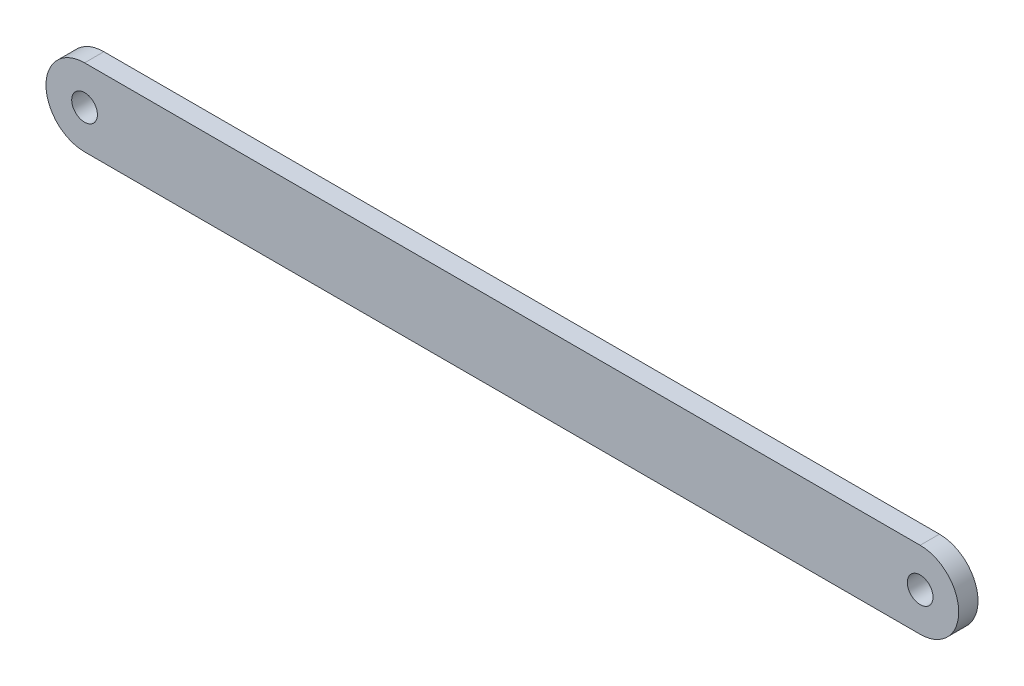
ISO-10303-21;
HEADER;
FILE_DESCRIPTION(('STEP AP214'),'2;1');
FILE_NAME('part.step','',(''),(''),'','','');
FILE_SCHEMA(('AUTOMOTIVE_DESIGN { 1 0 10303 214 1 1 1 1 }'));
ENDSEC;
DATA;
#1=APPLICATION_CONTEXT('core data for automotive mechanical design processes');
#2=APPLICATION_PROTOCOL_DEFINITION('international standard','automotive_design',2000,#1);
#3=PRODUCT_CONTEXT('',#1,'mechanical');
#4=PRODUCT('Part','Part','',(#3));
#5=PRODUCT_RELATED_PRODUCT_CATEGORY('part','',(#4));
#6=PRODUCT_DEFINITION_FORMATION('','',#4);
#7=PRODUCT_DEFINITION_CONTEXT('part definition',#1,'design');
#8=PRODUCT_DEFINITION('design','',#6,#7);
#9=PRODUCT_DEFINITION_SHAPE('','',#8);
#10=(LENGTH_UNIT() NAMED_UNIT(*) SI_UNIT(.MILLI.,.METRE.));
#11=(NAMED_UNIT(*) PLANE_ANGLE_UNIT() SI_UNIT($,.RADIAN.));
#12=(NAMED_UNIT(*) SI_UNIT($,.STERADIAN.) SOLID_ANGLE_UNIT());
#13=UNCERTAINTY_MEASURE_WITH_UNIT(LENGTH_MEASURE(1.E-05),#10,'distance_accuracy_value','');
#14=(GEOMETRIC_REPRESENTATION_CONTEXT(3) GLOBAL_UNCERTAINTY_ASSIGNED_CONTEXT((#13)) GLOBAL_UNIT_ASSIGNED_CONTEXT((#10,
#11,#12)) REPRESENTATION_CONTEXT('',''));
#15=CARTESIAN_POINT('',(0.,0.,0.));
#16=DIRECTION('',(0.,0.,1.));
#17=DIRECTION('',(1.,0.,0.));
#18=AXIS2_PLACEMENT_3D('',#15,#16,#17);
#19=CARTESIAN_POINT('',(-35.3127241673783,0.,3.));
#20=DIRECTION('',(0.,0.,1.));
#21=DIRECTION('',(1.,0.,0.));
#22=AXIS2_PLACEMENT_3D('',#19,#20,#21);
#23=PLANE('',#22);
#24=CARTESIAN_POINT('',(-35.3127241673783,0.,3.));
#25=DIRECTION('',(0.,0.,1.));
#26=DIRECTION('',(1.,0.,0.));
#27=AXIS2_PLACEMENT_3D('',#24,#25,#26);
#28=CIRCLE('',#27,2.);
#29=CARTESIAN_POINT('',(-33.3127241673783,0.,3.));
#30=VERTEX_POINT('',#29);
#31=EDGE_CURVE('E100',#30,#30,#28,.T.);
#32=ORIENTED_EDGE('',*,*,#31,.F.);
#33=EDGE_LOOP('',(#32));
#34=FACE_BOUND('',#33,.T.);
#35=CARTESIAN_POINT('',(-35.3127241673783,0.,3.));
#36=DIRECTION('',(0.,0.,1.));
#37=DIRECTION('',(1.,0.,0.));
#38=AXIS2_PLACEMENT_3D('',#35,#36,#37);
#39=CIRCLE('',#38,6.);
#40=CARTESIAN_POINT('',(-35.3127241673783,6.,3.));
#41=VERTEX_POINT('',#40);
#42=CARTESIAN_POINT('',(-35.3127241673783,-6.,3.));
#43=VERTEX_POINT('',#42);
#44=EDGE_CURVE('E85',#41,#43,#39,.T.);
#45=ORIENTED_EDGE('',*,*,#44,.T.);
#46=DIRECTION('',(1.,0.,0.));
#47=VECTOR('',#46,1.);
#48=CARTESIAN_POINT('',(-35.3127241673783,-6.,3.));
#49=LINE('',#48,#47);
#50=CARTESIAN_POINT('',(94.6872758326217,-6.,3.));
#51=VERTEX_POINT('',#50);
#52=EDGE_CURVE('E80',#43,#51,#49,.T.);
#53=ORIENTED_EDGE('',*,*,#52,.T.);
#54=CARTESIAN_POINT('',(94.6872758326217,0.,3.));
#55=DIRECTION('',(0.,0.,1.));
#56=DIRECTION('',(1.,0.,0.));
#57=AXIS2_PLACEMENT_3D('',#54,#55,#56);
#58=CIRCLE('',#57,6.);
#59=CARTESIAN_POINT('',(94.6872758326217,6.,3.));
#60=VERTEX_POINT('',#59);
#61=EDGE_CURVE('E83',#51,#60,#58,.T.);
#62=ORIENTED_EDGE('',*,*,#61,.T.);
#63=DIRECTION('',(-1.,0.,0.));
#64=VECTOR('',#63,1.);
#65=CARTESIAN_POINT('',(-35.3127241673783,6.,3.));
#66=LINE('',#65,#64);
#67=EDGE_CURVE('E50',#60,#41,#66,.T.);
#68=ORIENTED_EDGE('',*,*,#67,.T.);
#69=EDGE_LOOP('',(#45,#53,#62,#68));
#70=FACE_BOUND('',#69,.T.);
#71=CARTESIAN_POINT('',(94.6872758326217,0.,3.));
#72=DIRECTION('',(0.,0.,1.));
#73=DIRECTION('',(1.,0.,0.));
#74=AXIS2_PLACEMENT_3D('',#71,#72,#73);
#75=CIRCLE('',#74,2.);
#76=CARTESIAN_POINT('',(96.6872758326217,0.,3.));
#77=VERTEX_POINT('',#76);
#78=EDGE_CURVE('E115',#77,#77,#75,.T.);
#79=ORIENTED_EDGE('',*,*,#78,.F.);
#80=EDGE_LOOP('',(#79));
#81=FACE_BOUND('',#80,.T.);
#82=ADVANCED_FACE('F33',(#34,#70,#81),#23,.T.);
#83=CARTESIAN_POINT('',(-35.3127241673783,0.,0.));
#84=DIRECTION('',(0.,0.,1.));
#85=DIRECTION('',(1.,0.,0.));
#86=AXIS2_PLACEMENT_3D('',#83,#84,#85);
#87=PLANE('',#86);
#88=CARTESIAN_POINT('',(-35.3127241673783,0.,0.));
#89=DIRECTION('',(0.,0.,1.));
#90=DIRECTION('',(1.,0.,0.));
#91=AXIS2_PLACEMENT_3D('',#88,#89,#90);
#92=CIRCLE('',#91,2.);
#93=CARTESIAN_POINT('',(-33.3127241673783,0.,0.));
#94=VERTEX_POINT('',#93);
#95=EDGE_CURVE('E112',#94,#94,#92,.T.);
#96=ORIENTED_EDGE('',*,*,#95,.T.);
#97=EDGE_LOOP('',(#96));
#98=FACE_BOUND('',#97,.T.);
#99=CARTESIAN_POINT('',(-35.3127241673783,0.,0.));
#100=DIRECTION('',(0.,0.,1.));
#101=DIRECTION('',(1.,0.,0.));
#102=AXIS2_PLACEMENT_3D('',#99,#100,#101);
#103=CIRCLE('',#102,6.);
#104=CARTESIAN_POINT('',(-35.3127241673783,6.,0.));
#105=VERTEX_POINT('',#104);
#106=CARTESIAN_POINT('',(-35.3127241673783,-6.,0.));
#107=VERTEX_POINT('',#106);
#108=EDGE_CURVE('E97',#105,#107,#103,.T.);
#109=ORIENTED_EDGE('',*,*,#108,.F.);
#110=DIRECTION('',(-1.,0.,0.));
#111=VECTOR('',#110,1.);
#112=CARTESIAN_POINT('',(-35.3127241673783,6.,0.));
#113=LINE('',#112,#111);
#114=CARTESIAN_POINT('',(94.6872758326217,6.,0.));
#115=VERTEX_POINT('',#114);
#116=EDGE_CURVE('E73',#115,#105,#113,.T.);
#117=ORIENTED_EDGE('',*,*,#116,.F.);
#118=CARTESIAN_POINT('',(94.6872758326217,0.,0.));
#119=DIRECTION('',(0.,0.,1.));
#120=DIRECTION('',(1.,0.,0.));
#121=AXIS2_PLACEMENT_3D('',#118,#119,#120);
#122=CIRCLE('',#121,6.);
#123=CARTESIAN_POINT('',(94.6872758326217,-6.,0.));
#124=VERTEX_POINT('',#123);
#125=EDGE_CURVE('E67',#124,#115,#122,.T.);
#126=ORIENTED_EDGE('',*,*,#125,.F.);
#127=DIRECTION('',(1.,0.,0.));
#128=VECTOR('',#127,1.);
#129=CARTESIAN_POINT('',(-35.3127241673783,-6.,0.));
#130=LINE('',#129,#128);
#131=EDGE_CURVE('E89',#107,#124,#130,.T.);
#132=ORIENTED_EDGE('',*,*,#131,.F.);
#133=EDGE_LOOP('',(#109,#117,#126,#132));
#134=FACE_BOUND('',#133,.T.);
#135=CARTESIAN_POINT('',(94.6872758326217,0.,0.));
#136=DIRECTION('',(0.,0.,1.));
#137=DIRECTION('',(1.,0.,0.));
#138=AXIS2_PLACEMENT_3D('',#135,#136,#137);
#139=CIRCLE('',#138,2.);
#140=CARTESIAN_POINT('',(96.6872758326217,0.,0.));
#141=VERTEX_POINT('',#140);
#142=EDGE_CURVE('E118',#141,#141,#139,.T.);
#143=ORIENTED_EDGE('',*,*,#142,.T.);
#144=EDGE_LOOP('',(#143));
#145=FACE_BOUND('',#144,.T.);
#146=ADVANCED_FACE('F108',(#98,#134,#145),#87,.F.);
#147=CARTESIAN_POINT('',(-35.3127241673783,0.,3.));
#148=DIRECTION('',(0.,0.,-1.));
#149=DIRECTION('',(-1.,0.,0.));
#150=AXIS2_PLACEMENT_3D('',#147,#148,#149);
#151=CYLINDRICAL_SURFACE('',#150,6.);
#152=ORIENTED_EDGE('',*,*,#108,.T.);
#153=DIRECTION('',(0.,0.,-1.));
#154=VECTOR('',#153,1.);
#155=CARTESIAN_POINT('',(-35.3127241673783,-6.,3.));
#156=LINE('',#155,#154);
#157=EDGE_CURVE('E11',#43,#107,#156,.T.);
#158=ORIENTED_EDGE('',*,*,#157,.F.);
#159=ORIENTED_EDGE('',*,*,#44,.F.);
#160=DIRECTION('',(0.,0.,-1.));
#161=VECTOR('',#160,1.);
#162=CARTESIAN_POINT('',(-35.3127241673783,6.,3.));
#163=LINE('',#162,#161);
#164=EDGE_CURVE('E93',#41,#105,#163,.T.);
#165=ORIENTED_EDGE('',*,*,#164,.T.);
#166=EDGE_LOOP('',(#152,#158,#159,#165));
#167=FACE_BOUND('',#166,.T.);
#168=ADVANCED_FACE('F35',(#167),#151,.T.);
#169=CARTESIAN_POINT('',(-35.3127241673783,-6.,3.));
#170=DIRECTION('',(0.,1.,0.));
#171=DIRECTION('',(0.,0.,1.));
#172=AXIS2_PLACEMENT_3D('',#169,#170,#171);
#173=PLANE('',#172);
#174=ORIENTED_EDGE('',*,*,#131,.T.);
#175=DIRECTION('',(0.,0.,-1.));
#176=VECTOR('',#175,1.);
#177=CARTESIAN_POINT('',(94.6872758326217,-6.,3.));
#178=LINE('',#177,#176);
#179=EDGE_CURVE('E42',#51,#124,#178,.T.);
#180=ORIENTED_EDGE('',*,*,#179,.F.);
#181=ORIENTED_EDGE('',*,*,#52,.F.);
#182=ORIENTED_EDGE('',*,*,#157,.T.);
#183=EDGE_LOOP('',(#174,#180,#181,#182));
#184=FACE_BOUND('',#183,.T.);
#185=ADVANCED_FACE('F88',(#184),#173,.F.);
#186=CARTESIAN_POINT('',(94.6872758326217,0.,3.));
#187=DIRECTION('',(0.,0.,-1.));
#188=DIRECTION('',(-1.,0.,0.));
#189=AXIS2_PLACEMENT_3D('',#186,#187,#188);
#190=CYLINDRICAL_SURFACE('',#189,6.);
#191=ORIENTED_EDGE('',*,*,#125,.T.);
#192=DIRECTION('',(0.,0.,-1.));
#193=VECTOR('',#192,1.);
#194=CARTESIAN_POINT('',(94.6872758326217,6.,3.));
#195=LINE('',#194,#193);
#196=EDGE_CURVE('E90',#60,#115,#195,.T.);
#197=ORIENTED_EDGE('',*,*,#196,.F.);
#198=ORIENTED_EDGE('',*,*,#61,.F.);
#199=ORIENTED_EDGE('',*,*,#179,.T.);
#200=EDGE_LOOP('',(#191,#197,#198,#199));
#201=FACE_BOUND('',#200,.T.);
#202=ADVANCED_FACE('F91',(#201),#190,.T.);
#203=CARTESIAN_POINT('',(-35.3127241673783,6.,3.));
#204=DIRECTION('',(0.,-1.,0.));
#205=DIRECTION('',(0.,0.,-1.));
#206=AXIS2_PLACEMENT_3D('',#203,#204,#205);
#207=PLANE('',#206);
#208=ORIENTED_EDGE('',*,*,#116,.T.);
#209=ORIENTED_EDGE('',*,*,#164,.F.);
#210=ORIENTED_EDGE('',*,*,#67,.F.);
#211=ORIENTED_EDGE('',*,*,#196,.T.);
#212=EDGE_LOOP('',(#208,#209,#210,#211));
#213=FACE_BOUND('',#212,.T.);
#214=ADVANCED_FACE('F105',(#213),#207,.F.);
#215=CARTESIAN_POINT('',(-35.3127241673783,0.,3.));
#216=DIRECTION('',(0.,0.,-1.));
#217=DIRECTION('',(-1.,0.,0.));
#218=AXIS2_PLACEMENT_3D('',#215,#216,#217);
#219=CYLINDRICAL_SURFACE('',#218,2.);
#220=ORIENTED_EDGE('',*,*,#31,.T.);
#221=EDGE_LOOP('',(#220));
#222=FACE_BOUND('',#221,.T.);
#223=ORIENTED_EDGE('',*,*,#95,.F.);
#224=EDGE_LOOP('',(#223));
#225=FACE_BOUND('',#224,.T.);
#226=ADVANCED_FACE('F136',(#222,#225),#219,.F.);
#227=CARTESIAN_POINT('',(94.6872758326217,0.,3.));
#228=DIRECTION('',(0.,0.,-1.));
#229=DIRECTION('',(-1.,0.,0.));
#230=AXIS2_PLACEMENT_3D('',#227,#228,#229);
#231=CYLINDRICAL_SURFACE('',#230,2.);
#232=ORIENTED_EDGE('',*,*,#78,.T.);
#233=EDGE_LOOP('',(#232));
#234=FACE_BOUND('',#233,.T.);
#235=ORIENTED_EDGE('',*,*,#142,.F.);
#236=EDGE_LOOP('',(#235));
#237=FACE_BOUND('',#236,.T.);
#238=ADVANCED_FACE('F124',(#234,#237),#231,.F.);
#239=CLOSED_SHELL('',(#82,#146,#168,#185,#202,#214,#226,#238));
#240=MANIFOLD_SOLID_BREP('B2',#239);
#241=ADVANCED_BREP_SHAPE_REPRESENTATION('',(#18,#240),#14);
#242=SHAPE_DEFINITION_REPRESENTATION(#9,#241);
ENDSEC;
END-ISO-10303-21;
